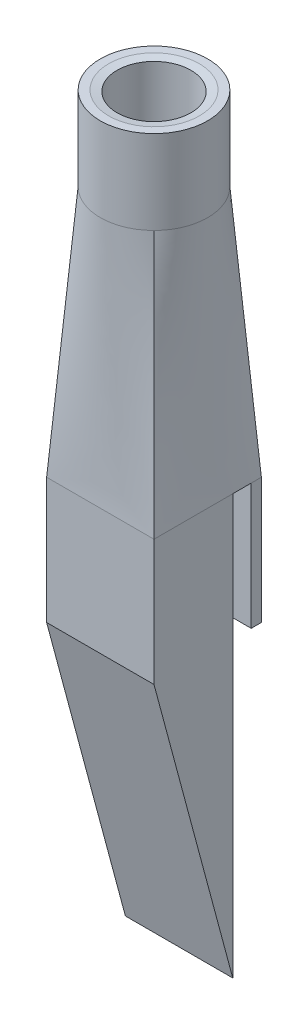
ISO-10303-21;
HEADER;
FILE_DESCRIPTION(('STEP AP214'),'2;1');
FILE_NAME('part.step','',(''),(''),'','','');
FILE_SCHEMA(('AUTOMOTIVE_DESIGN { 1 0 10303 214 1 1 1 1 }'));
ENDSEC;
DATA;
#1=APPLICATION_CONTEXT('core data for automotive mechanical design processes');
#2=APPLICATION_PROTOCOL_DEFINITION('international standard','automotive_design',2000,#1);
#3=PRODUCT_CONTEXT('',#1,'mechanical');
#4=PRODUCT('Part','Part','',(#3));
#5=PRODUCT_RELATED_PRODUCT_CATEGORY('part','',(#4));
#6=PRODUCT_DEFINITION_FORMATION('','',#4);
#7=PRODUCT_DEFINITION_CONTEXT('part definition',#1,'design');
#8=PRODUCT_DEFINITION('design','',#6,#7);
#9=PRODUCT_DEFINITION_SHAPE('','',#8);
#10=(LENGTH_UNIT() NAMED_UNIT(*) SI_UNIT(.MILLI.,.METRE.));
#11=(NAMED_UNIT(*) PLANE_ANGLE_UNIT() SI_UNIT($,.RADIAN.));
#12=(NAMED_UNIT(*) SI_UNIT($,.STERADIAN.) SOLID_ANGLE_UNIT());
#13=UNCERTAINTY_MEASURE_WITH_UNIT(LENGTH_MEASURE(1.E-05),#10,'distance_accuracy_value','');
#14=(GEOMETRIC_REPRESENTATION_CONTEXT(3) GLOBAL_UNCERTAINTY_ASSIGNED_CONTEXT((#13)) GLOBAL_UNIT_ASSIGNED_CONTEXT((#10,
#11,#12)) REPRESENTATION_CONTEXT('',''));
#15=CARTESIAN_POINT('',(0.,0.,0.));
#16=DIRECTION('',(0.,0.,1.));
#17=DIRECTION('',(1.,0.,0.));
#18=AXIS2_PLACEMENT_3D('',#15,#16,#17);
#19=CARTESIAN_POINT('',(0.,-30.,0.));
#20=DIRECTION('',(0.,1.,0.));
#21=DIRECTION('',(0.,0.,1.));
#22=AXIS2_PLACEMENT_3D('',#19,#20,#21);
#23=PLANE('',#22);
#24=DIRECTION('',(-1.,0.,0.));
#25=VECTOR('',#24,1.);
#26=CARTESIAN_POINT('',(0.,-30.,-5.19));
#27=LINE('',#26,#25);
#28=CARTESIAN_POINT('',(6.4,-30.,-5.19));
#29=VERTEX_POINT('',#28);
#30=CARTESIAN_POINT('',(-6.4,-30.,-5.19));
#31=VERTEX_POINT('',#30);
#32=EDGE_CURVE('E97',#29,#31,#27,.T.);
#33=ORIENTED_EDGE('',*,*,#32,.F.);
#34=DIRECTION('',(0.,0.,1.));
#35=VECTOR('',#34,1.);
#36=CARTESIAN_POINT('',(6.4,-30.,-6.4));
#37=LINE('',#36,#35);
#38=CARTESIAN_POINT('',(6.4,-30.,-2.99));
#39=VERTEX_POINT('',#38);
#40=EDGE_CURVE('E415',#29,#39,#37,.T.);
#41=ORIENTED_EDGE('',*,*,#40,.T.);
#42=DIRECTION('',(-1.,0.,0.));
#43=VECTOR('',#42,1.);
#44=CARTESIAN_POINT('',(0.,-30.,-2.99));
#45=LINE('',#44,#43);
#46=CARTESIAN_POINT('',(-6.4,-30.,-2.99));
#47=VERTEX_POINT('',#46);
#48=EDGE_CURVE('E214',#39,#47,#45,.T.);
#49=ORIENTED_EDGE('',*,*,#48,.T.);
#50=DIRECTION('',(0.,0.,-1.));
#51=VECTOR('',#50,1.);
#52=CARTESIAN_POINT('',(-6.4,-30.,-6.4));
#53=LINE('',#52,#51);
#54=EDGE_CURVE('E273',#47,#31,#53,.T.);
#55=ORIENTED_EDGE('',*,*,#54,.T.);
#56=EDGE_LOOP('',(#33,#41,#49,#55));
#57=FACE_BOUND('',#56,.T.);
#58=ADVANCED_FACE('F75',(#57),#23,.F.);
#59=CARTESIAN_POINT('',(0.,10.,0.));
#60=DIRECTION('',(0.,1.,0.));
#61=DIRECTION('',(0.,0.,1.));
#62=AXIS2_PLACEMENT_3D('',#59,#60,#61);
#63=PLANE('',#62);
#64=CARTESIAN_POINT('',(0.,10.,0.));
#65=DIRECTION('',(0.,1.,0.));
#66=DIRECTION('',(0.,0.,1.));
#67=AXIS2_PLACEMENT_3D('',#64,#65,#66);
#68=CIRCLE('',#67,5.40000000000002);
#69=CARTESIAN_POINT('',(0.,10.,5.40000000000002));
#70=VERTEX_POINT('',#69);
#71=EDGE_CURVE('E12',#70,#70,#68,.F.);
#72=ORIENTED_EDGE('',*,*,#71,.T.);
#73=EDGE_LOOP('',(#72));
#74=FACE_BOUND('',#73,.T.);
#75=CARTESIAN_POINT('',(0.,10.,0.));
#76=DIRECTION('',(0.,1.,0.));
#77=DIRECTION('',(0.,0.,1.));
#78=AXIS2_PLACEMENT_3D('',#75,#76,#77);
#79=CIRCLE('',#78,6.4);
#80=CARTESIAN_POINT('',(0.,10.,6.4));
#81=VERTEX_POINT('',#80);
#82=EDGE_CURVE('E647',#81,#81,#79,.T.);
#83=ORIENTED_EDGE('',*,*,#82,.T.);
#84=EDGE_LOOP('',(#83));
#85=FACE_BOUND('',#84,.T.);
#86=ADVANCED_FACE('F298',(#74,#85),#63,.T.);
#87=CARTESIAN_POINT('',(0.,10.,0.));
#88=DIRECTION('',(0.,-1.,0.));
#89=DIRECTION('',(0.,0.,-1.));
#90=AXIS2_PLACEMENT_3D('',#87,#88,#89);
#91=CYLINDRICAL_SURFACE('',#90,6.4);
#92=ORIENTED_EDGE('',*,*,#82,.F.);
#93=EDGE_LOOP('',(#92));
#94=FACE_BOUND('',#93,.T.);
#95=CARTESIAN_POINT('',(4.5254833995939,0.,-4.5254833995939));
#96=CARTESIAN_POINT('',(4.79215006626057,0.,-4.25881673292724));
#97=CARTESIAN_POINT('',(5.04508306967116,0.,-3.95847162228839));
#98=CARTESIAN_POINT('',(5.50172271939158,0.,-3.29445107465197));
#99=CARTESIAN_POINT('',(5.70528151747109,0.,-2.93074172777278));
#100=CARTESIAN_POINT('',(6.0418145209194,0.,-2.15312832021532));
#101=CARTESIAN_POINT('',(6.17462377545561,0.,-1.73928513955465));
#102=CARTESIAN_POINT('',(6.35377211773431,0.,-0.883556133473917));
#103=CARTESIAN_POINT('',(6.4,0.,-0.441827799864635));
#104=CARTESIAN_POINT('',(6.4,0.,0.441827799864634));
#105=CARTESIAN_POINT('',(6.35377211773431,0.,0.883556133473917));
#106=CARTESIAN_POINT('',(6.17462377545561,0.,1.73928513955465));
#107=CARTESIAN_POINT('',(6.0418145209194,0.,2.15312832021532));
#108=CARTESIAN_POINT('',(5.70528151747109,0.,2.93074172777278));
#109=CARTESIAN_POINT('',(5.50172271939158,0.,3.29445107465197));
#110=CARTESIAN_POINT('',(5.04508306967116,0.,3.95847162228839));
#111=CARTESIAN_POINT('',(4.79215006626057,0.,4.25881673292724));
#112=CARTESIAN_POINT('',(4.5254833995939,0.,4.5254833995939));
#113=B_SPLINE_CURVE_WITH_KNOTS('',3,(#95,#96,#97,#98,#99,#100,#101,#102,#103,#104,#105,#106,
#107,#108,#109,#110,#111,#112),.UNSPECIFIED.,.F.,.F.,(4,2,2,2,2,2,2,2,4),(0.,0.125,0.25,0.375,
0.5,0.625,0.75,0.875,1.),.UNSPECIFIED.);
#114=CARTESIAN_POINT('',(4.5254833995939,0.,4.5254833995939));
#115=VERTEX_POINT('',#114);
#116=CARTESIAN_POINT('',(4.5254833995939,0.,-4.5254833995939));
#117=VERTEX_POINT('',#116);
#118=EDGE_CURVE('E650',#115,#117,#113,.F.);
#119=ORIENTED_EDGE('',*,*,#118,.T.);
#120=CARTESIAN_POINT('',(0.,0.,0.));
#121=DIRECTION('',(0.,-1.,0.));
#122=DIRECTION('',(0.,0.,-1.));
#123=AXIS2_PLACEMENT_3D('',#120,#121,#122);
#124=CIRCLE('',#123,6.4);
#125=CARTESIAN_POINT('',(-4.5254833995939,0.,-4.5254833995939));
#126=VERTEX_POINT('',#125);
#127=EDGE_CURVE('E223',#126,#117,#124,.T.);
#128=ORIENTED_EDGE('',*,*,#127,.F.);
#129=CARTESIAN_POINT('',(-4.5254833995939,0.,4.5254833995939));
#130=VERTEX_POINT('',#129);
#131=EDGE_CURVE('E335',#130,#126,#124,.T.);
#132=ORIENTED_EDGE('',*,*,#131,.F.);
#133=EDGE_CURVE('E338',#115,#130,#124,.T.);
#134=ORIENTED_EDGE('',*,*,#133,.F.);
#135=EDGE_LOOP('',(#119,#128,#132,#134));
#136=FACE_BOUND('',#135,.T.);
#137=ADVANCED_FACE('F308',(#94,#136),#91,.T.);
#138=CARTESIAN_POINT('',(0.,10.,0.));
#139=DIRECTION('',(0.,-1.,0.));
#140=DIRECTION('',(0.,0.,-1.));
#141=AXIS2_PLACEMENT_3D('',#138,#139,#140);
#142=CYLINDRICAL_SURFACE('',#141,4.4);
#143=CARTESIAN_POINT('',(0.,9.82367301929154,0.));
#144=DIRECTION('',(0.,1.,0.));
#145=DIRECTION('',(0.,0.,1.));
#146=AXIS2_PLACEMENT_3D('',#143,#144,#145);
#147=CIRCLE('',#146,4.4);
#148=CARTESIAN_POINT('',(0.,9.82367301929154,4.4));
#149=VERTEX_POINT('',#148);
#150=EDGE_CURVE('E86',#149,#149,#147,.T.);
#151=ORIENTED_EDGE('',*,*,#150,.T.);
#152=EDGE_LOOP('',(#151));
#153=FACE_BOUND('',#152,.T.);
#154=CARTESIAN_POINT('',(0.,0.,0.));
#155=DIRECTION('',(0.,1.,0.));
#156=DIRECTION('',(0.,0.,1.));
#157=AXIS2_PLACEMENT_3D('',#154,#155,#156);
#158=CIRCLE('',#157,4.4);
#159=CARTESIAN_POINT('',(0.,0.,4.4));
#160=VERTEX_POINT('',#159);
#161=EDGE_CURVE('E286',#160,#160,#158,.T.);
#162=ORIENTED_EDGE('',*,*,#161,.F.);
#163=EDGE_LOOP('',(#162));
#164=FACE_BOUND('',#163,.T.);
#165=ADVANCED_FACE('F304',(#153,#164),#142,.F.);
#166=CARTESIAN_POINT('',(0.,9.82367301929154,0.));
#167=DIRECTION('',(0.,1.,0.));
#168=DIRECTION('',(0.,0.,1.));
#169=AXIS2_PLACEMENT_3D('',#166,#167,#168);
#170=CONICAL_SURFACE('',#169,4.4,1.39626340159547);
#171=ORIENTED_EDGE('',*,*,#71,.F.);
#172=EDGE_LOOP('',(#171));
#173=FACE_BOUND('',#172,.T.);
#174=ORIENTED_EDGE('',*,*,#150,.F.);
#175=EDGE_LOOP('',(#174));
#176=FACE_BOUND('',#175,.T.);
#177=ADVANCED_FACE('F78',(#173,#176),#170,.F.);
#178=CARTESIAN_POINT('',(0.,0.,0.));
#179=DIRECTION('',(0.,-1.,0.));
#180=DIRECTION('',(0.,0.,-1.));
#181=AXIS2_PLACEMENT_3D('',#178,#179,#180);
#182=PLANE('',#181);
#183=ORIENTED_EDGE('',*,*,#161,.T.);
#184=EDGE_LOOP('',(#183));
#185=FACE_BOUND('',#184,.T.);
#186=ADVANCED_FACE('F587',(#185),#182,.F.);
#187=CARTESIAN_POINT('',(-4.5254833995939,0.,-4.5254833995939));
#188=CARTESIAN_POINT('',(-6.4,-30.,-6.4));
#189=CARTESIAN_POINT('',(-4.25881673292724,0.,-4.79215006626057));
#190=CARTESIAN_POINT('',(-5.86666666666667,-30.,-6.4));
#191=CARTESIAN_POINT('',(-3.95847162228839,0.,-5.04508306967116));
#192=CARTESIAN_POINT('',(-5.33333333333333,-30.,-6.4));
#193=CARTESIAN_POINT('',(-3.29445107465197,0.,-5.50172271939158));
#194=CARTESIAN_POINT('',(-4.26666666666666,-30.,-6.4));
#195=CARTESIAN_POINT('',(-2.93074172777278,0.,-5.70528151747108));
#196=CARTESIAN_POINT('',(-3.73333333333333,-30.,-6.4));
#197=CARTESIAN_POINT('',(-2.15312832021532,0.,-6.0418145209194));
#198=CARTESIAN_POINT('',(-2.66666666666667,-30.,-6.4));
#199=CARTESIAN_POINT('',(-1.73928513955465,0.,-6.17462377545561));
#200=CARTESIAN_POINT('',(-2.13333333333333,-30.,-6.4));
#201=CARTESIAN_POINT('',(-0.883556133473918,0.,-6.3537721177343));
#202=CARTESIAN_POINT('',(-1.06666666666667,-30.,-6.4));
#203=CARTESIAN_POINT('',(-0.441827799864636,0.,-6.4));
#204=CARTESIAN_POINT('',(-0.533333333333333,-30.,-6.4));
#205=CARTESIAN_POINT('',(0.441827799864634,0.,-6.4));
#206=CARTESIAN_POINT('',(0.533333333333334,-30.,-6.4));
#207=CARTESIAN_POINT('',(0.883556133473917,0.,-6.35377211773431));
#208=CARTESIAN_POINT('',(1.06666666666667,-30.,-6.4));
#209=CARTESIAN_POINT('',(1.73928513955465,0.,-6.17462377545561));
#210=CARTESIAN_POINT('',(2.13333333333333,-30.,-6.4));
#211=CARTESIAN_POINT('',(2.15312832021532,0.,-6.0418145209194));
#212=CARTESIAN_POINT('',(2.66666666666667,-30.,-6.4));
#213=CARTESIAN_POINT('',(2.93074172777278,0.,-5.70528151747108));
#214=CARTESIAN_POINT('',(3.73333333333333,-30.,-6.4));
#215=CARTESIAN_POINT('',(3.29445107465197,0.,-5.50172271939158));
#216=CARTESIAN_POINT('',(4.26666666666667,-30.,-6.4));
#217=CARTESIAN_POINT('',(3.95847162228839,0.,-5.04508306967116));
#218=CARTESIAN_POINT('',(5.33333333333333,-30.,-6.4));
#219=CARTESIAN_POINT('',(4.25881673292724,0.,-4.79215006626057));
#220=CARTESIAN_POINT('',(5.86666666666667,-30.,-6.4));
#221=CARTESIAN_POINT('',(4.5254833995939,0.,-4.5254833995939));
#222=CARTESIAN_POINT('',(6.4,-30.,-6.4));
#223=B_SPLINE_SURFACE_WITH_KNOTS('',3,1,((#187,#188),(#189,#190),(#191,#192),(#193,#194),(#195,
#196),(#197,#198),(#199,#200),(#201,#202),(#203,#204),(#205,#206),(#207,#208),(#209,#210),(#211,
#212),(#213,#214),(#215,#216),(#217,#218),(#219,#220),(#221,#222)),.UNSPECIFIED.,.F.,.F.,.F.,(4,
2,2,2,2,2,2,2,4),(2,2),(0.,0.125,0.25,0.375,0.5,0.625,0.75,0.875,1.),(0.,1.),.UNSPECIFIED.);
#224=DIRECTION('',(0.0622413542695361,-0.996118480722744,-0.0622413542695361));
#225=VECTOR('',#224,1.);
#226=CARTESIAN_POINT('',(5.46274169979695,-15.,-5.46274169979695));
#227=LINE('',#226,#225);
#228=CARTESIAN_POINT('',(6.4,-30.,-6.4));
#229=VERTEX_POINT('',#228);
#230=EDGE_CURVE('E661',#117,#229,#227,.T.);
#231=DIRECTION('',(1.,0.,0.));
#232=VECTOR('',#231,1.);
#233=CARTESIAN_POINT('',(-6.4,-30.,-6.4));
#234=LINE('',#233,#232);
#235=CARTESIAN_POINT('',(-6.4,-30.,-6.4));
#236=VERTEX_POINT('',#235);
#237=EDGE_CURVE('E80',#236,#229,#234,.T.);
#238=DIRECTION('',(0.0622413542695361,0.996118480722744,0.0622413542695361));
#239=VECTOR('',#238,1.);
#240=CARTESIAN_POINT('',(-5.46274169979695,-15.,-5.46274169979695));
#241=LINE('',#240,#239);
#242=EDGE_CURVE('E340',#236,#126,#241,.T.);
#243=ORIENTED_EDGE('',*,*,#127,.T.);
#244=ORIENTED_EDGE('',*,*,#230,.T.);
#245=ORIENTED_EDGE('',*,*,#237,.F.);
#246=ORIENTED_EDGE('',*,*,#242,.T.);
#247=EDGE_LOOP('',(#243,#244,#245,#246));
#248=FACE_BOUND('',#247,.T.);
#249=ADVANCED_FACE('F368',(#248),#223,.T.);
#250=CARTESIAN_POINT('',(4.5254833995939,0.,-4.5254833995939));
#251=CARTESIAN_POINT('',(6.4,-30.,-6.4));
#252=CARTESIAN_POINT('',(4.79215006626057,0.,-4.25881673292724));
#253=CARTESIAN_POINT('',(6.4,-30.,-5.86666666666667));
#254=CARTESIAN_POINT('',(5.04508306967116,0.,-3.95847162228839));
#255=CARTESIAN_POINT('',(6.4,-30.,-5.33333333333333));
#256=CARTESIAN_POINT('',(5.50172271939158,0.,-3.29445107465197));
#257=CARTESIAN_POINT('',(6.4,-30.,-4.26666666666667));
#258=CARTESIAN_POINT('',(5.70528151747109,0.,-2.93074172777278));
#259=CARTESIAN_POINT('',(6.4,-30.,-3.73333333333333));
#260=CARTESIAN_POINT('',(6.0418145209194,0.,-2.15312832021532));
#261=CARTESIAN_POINT('',(6.4,-30.,-2.66666666666667));
#262=CARTESIAN_POINT('',(6.17462377545561,0.,-1.73928513955465));
#263=CARTESIAN_POINT('',(6.4,-30.,-2.13333333333333));
#264=CARTESIAN_POINT('',(6.35377211773431,0.,-0.883556133473917));
#265=CARTESIAN_POINT('',(6.4,-30.,-1.06666666666667));
#266=CARTESIAN_POINT('',(6.4,0.,-0.441827799864635));
#267=CARTESIAN_POINT('',(6.4,-30.,-0.533333333333334));
#268=CARTESIAN_POINT('',(6.4,0.,0.441827799864634));
#269=CARTESIAN_POINT('',(6.4,-30.,0.533333333333333));
#270=CARTESIAN_POINT('',(6.35377211773431,0.,0.883556133473917));
#271=CARTESIAN_POINT('',(6.4,-30.,1.06666666666667));
#272=CARTESIAN_POINT('',(6.17462377545561,0.,1.73928513955465));
#273=CARTESIAN_POINT('',(6.4,-30.,2.13333333333333));
#274=CARTESIAN_POINT('',(6.0418145209194,0.,2.15312832021532));
#275=CARTESIAN_POINT('',(6.4,-30.,2.66666666666667));
#276=CARTESIAN_POINT('',(5.70528151747109,0.,2.93074172777278));
#277=CARTESIAN_POINT('',(6.4,-30.,3.73333333333333));
#278=CARTESIAN_POINT('',(5.50172271939158,0.,3.29445107465197));
#279=CARTESIAN_POINT('',(6.4,-30.,4.26666666666667));
#280=CARTESIAN_POINT('',(5.04508306967116,0.,3.95847162228839));
#281=CARTESIAN_POINT('',(6.4,-30.,5.33333333333333));
#282=CARTESIAN_POINT('',(4.79215006626057,0.,4.25881673292724));
#283=CARTESIAN_POINT('',(6.4,-30.,5.86666666666667));
#284=CARTESIAN_POINT('',(4.5254833995939,0.,4.5254833995939));
#285=CARTESIAN_POINT('',(6.4,-30.,6.4));
#286=B_SPLINE_SURFACE_WITH_KNOTS('',3,1,((#250,#251),(#252,#253),(#254,#255),(#256,#257),(#258,
#259),(#260,#261),(#262,#263),(#264,#265),(#266,#267),(#268,#269),(#270,#271),(#272,#273),(#274,
#275),(#276,#277),(#278,#279),(#280,#281),(#282,#283),(#284,#285)),.UNSPECIFIED.,.F.,.F.,.F.,(4,
2,2,2,2,2,2,2,4),(2,2),(0.,0.125,0.25,0.375,0.5,0.625,0.75,0.875,1.),(0.,1.),.UNSPECIFIED.);
#287=DIRECTION('',(0.0622413542695361,-0.996118480722744,0.0622413542695361));
#288=VECTOR('',#287,1.);
#289=CARTESIAN_POINT('',(5.46274169979695,-15.,5.46274169979695));
#290=LINE('',#289,#288);
#291=CARTESIAN_POINT('',(6.4,-30.,6.4));
#292=VERTEX_POINT('',#291);
#293=EDGE_CURVE('E664',#115,#292,#290,.T.);
#294=CARTESIAN_POINT('',(6.4,-30.,6.4));
#295=CARTESIAN_POINT('',(6.4,-30.,5.86666666666667));
#296=CARTESIAN_POINT('',(6.4,-30.,5.33333333333333));
#297=CARTESIAN_POINT('',(6.4,-30.,4.26666666666667));
#298=CARTESIAN_POINT('',(6.4,-30.,3.73333333333333));
#299=CARTESIAN_POINT('',(6.4,-30.,2.66666666666667));
#300=CARTESIAN_POINT('',(6.4,-30.,2.13333333333333));
#301=CARTESIAN_POINT('',(6.4,-30.,1.06666666666667));
#302=CARTESIAN_POINT('',(6.4,-30.,0.533333333333333));
#303=CARTESIAN_POINT('',(6.4,-30.,-0.533333333333334));
#304=CARTESIAN_POINT('',(6.4,-30.,-1.06666666666667));
#305=CARTESIAN_POINT('',(6.4,-30.,-2.13333333333333));
#306=CARTESIAN_POINT('',(6.4,-30.,-2.66666666666667));
#307=CARTESIAN_POINT('',(6.4,-30.,-3.73333333333333));
#308=CARTESIAN_POINT('',(6.4,-30.,-4.26666666666667));
#309=CARTESIAN_POINT('',(6.4,-30.,-5.33333333333333));
#310=CARTESIAN_POINT('',(6.4,-30.,-5.86666666666667));
#311=CARTESIAN_POINT('',(6.4,-30.,-6.4));
#312=B_SPLINE_CURVE_WITH_KNOTS('',3,(#294,#295,#296,#297,#298,#299,#300,#301,#302,#303,#304,
#305,#306,#307,#308,#309,#310,#311),.UNSPECIFIED.,.F.,.F.,(4,2,2,2,2,2,2,2,4),(0.,0.125,0.25,
0.375,0.5,0.625,0.75,0.875,1.),.UNSPECIFIED.);
#313=EDGE_CURVE('E208',#292,#39,#312,.T.);
#314=EDGE_CURVE('E274',#229,#29,#37,.T.);
#315=ORIENTED_EDGE('',*,*,#118,.F.);
#316=ORIENTED_EDGE('',*,*,#293,.T.);
#317=ORIENTED_EDGE('',*,*,#313,.T.);
#318=ORIENTED_EDGE('',*,*,#40,.F.);
#319=ORIENTED_EDGE('',*,*,#314,.F.);
#320=ORIENTED_EDGE('',*,*,#230,.F.);
#321=EDGE_LOOP('',(#315,#316,#317,#318,#319,#320));
#322=FACE_BOUND('',#321,.T.);
#323=ADVANCED_FACE('F356',(#322),#286,.T.);
#324=CARTESIAN_POINT('',(-4.5254833995939,0.,4.5254833995939));
#325=CARTESIAN_POINT('',(-6.4,-30.,6.4));
#326=CARTESIAN_POINT('',(-4.79215006626057,0.,4.25881673292724));
#327=CARTESIAN_POINT('',(-6.4,-30.,5.86666666666667));
#328=CARTESIAN_POINT('',(-5.04508306967116,0.,3.95847162228839));
#329=CARTESIAN_POINT('',(-6.4,-30.,5.33333333333333));
#330=CARTESIAN_POINT('',(-5.50172271939158,0.,3.29445107465197));
#331=CARTESIAN_POINT('',(-6.4,-30.,4.26666666666667));
#332=CARTESIAN_POINT('',(-5.70528151747109,0.,2.93074172777278));
#333=CARTESIAN_POINT('',(-6.4,-30.,3.73333333333333));
#334=CARTESIAN_POINT('',(-6.0418145209194,0.,2.15312832021532));
#335=CARTESIAN_POINT('',(-6.4,-30.,2.66666666666667));
#336=CARTESIAN_POINT('',(-6.17462377545561,0.,1.73928513955465));
#337=CARTESIAN_POINT('',(-6.4,-30.,2.13333333333333));
#338=CARTESIAN_POINT('',(-6.35377211773431,0.,0.883556133473918));
#339=CARTESIAN_POINT('',(-6.4,-30.,1.06666666666667));
#340=CARTESIAN_POINT('',(-6.4,0.,0.441827799864636));
#341=CARTESIAN_POINT('',(-6.4,-30.,0.533333333333334));
#342=CARTESIAN_POINT('',(-6.4,0.,-0.441827799864634));
#343=CARTESIAN_POINT('',(-6.4,-30.,-0.533333333333333));
#344=CARTESIAN_POINT('',(-6.35377211773431,0.,-0.883556133473916));
#345=CARTESIAN_POINT('',(-6.4,-30.,-1.06666666666667));
#346=CARTESIAN_POINT('',(-6.17462377545561,0.,-1.73928513955465));
#347=CARTESIAN_POINT('',(-6.4,-30.,-2.13333333333333));
#348=CARTESIAN_POINT('',(-6.0418145209194,0.,-2.15312832021532));
#349=CARTESIAN_POINT('',(-6.4,-30.,-2.66666666666667));
#350=CARTESIAN_POINT('',(-5.70528151747109,0.,-2.93074172777278));
#351=CARTESIAN_POINT('',(-6.4,-30.,-3.73333333333333));
#352=CARTESIAN_POINT('',(-5.50172271939158,0.,-3.29445107465197));
#353=CARTESIAN_POINT('',(-6.4,-30.,-4.26666666666667));
#354=CARTESIAN_POINT('',(-5.04508306967116,0.,-3.95847162228839));
#355=CARTESIAN_POINT('',(-6.4,-30.,-5.33333333333333));
#356=CARTESIAN_POINT('',(-4.79215006626057,0.,-4.25881673292724));
#357=CARTESIAN_POINT('',(-6.4,-30.,-5.86666666666667));
#358=CARTESIAN_POINT('',(-4.5254833995939,0.,-4.5254833995939));
#359=CARTESIAN_POINT('',(-6.4,-30.,-6.4));
#360=B_SPLINE_SURFACE_WITH_KNOTS('',3,1,((#324,#325),(#326,#327),(#328,#329),(#330,#331),(#332,
#333),(#334,#335),(#336,#337),(#338,#339),(#340,#341),(#342,#343),(#344,#345),(#346,#347),(#348,
#349),(#350,#351),(#352,#353),(#354,#355),(#356,#357),(#358,#359)),.UNSPECIFIED.,.F.,.F.,.F.,(4,
2,2,2,2,2,2,2,4),(2,2),(0.,0.125,0.25,0.375,0.5,0.625,0.75,0.875,1.),(0.,1.),.UNSPECIFIED.);
#361=CARTESIAN_POINT('',(-6.4,-30.,-6.4));
#362=CARTESIAN_POINT('',(-6.4,-30.,-5.86666666666667));
#363=CARTESIAN_POINT('',(-6.4,-30.,-5.33333333333333));
#364=CARTESIAN_POINT('',(-6.4,-30.,-4.26666666666667));
#365=CARTESIAN_POINT('',(-6.4,-30.,-3.73333333333333));
#366=CARTESIAN_POINT('',(-6.4,-30.,-2.66666666666667));
#367=CARTESIAN_POINT('',(-6.4,-30.,-2.13333333333333));
#368=CARTESIAN_POINT('',(-6.4,-30.,-1.06666666666667));
#369=CARTESIAN_POINT('',(-6.4,-30.,-0.533333333333333));
#370=CARTESIAN_POINT('',(-6.4,-30.,0.533333333333334));
#371=CARTESIAN_POINT('',(-6.4,-30.,1.06666666666667));
#372=CARTESIAN_POINT('',(-6.4,-30.,2.13333333333333));
#373=CARTESIAN_POINT('',(-6.4,-30.,2.66666666666667));
#374=CARTESIAN_POINT('',(-6.4,-30.,3.73333333333333));
#375=CARTESIAN_POINT('',(-6.4,-30.,4.26666666666667));
#376=CARTESIAN_POINT('',(-6.4,-30.,5.33333333333333));
#377=CARTESIAN_POINT('',(-6.4,-30.,5.86666666666667));
#378=CARTESIAN_POINT('',(-6.4,-30.,6.4));
#379=B_SPLINE_CURVE_WITH_KNOTS('',3,(#361,#362,#363,#364,#365,#366,#367,#368,#369,#370,#371,
#372,#373,#374,#375,#376,#377,#378),.UNSPECIFIED.,.F.,.F.,(4,2,2,2,2,2,2,2,4),(0.,0.125,0.25,
0.375,0.5,0.625,0.75,0.875,1.),.UNSPECIFIED.);
#380=EDGE_CURVE('E105',#236,#31,#379,.T.);
#381=CARTESIAN_POINT('',(-6.4,-30.,6.4));
#382=VERTEX_POINT('',#381);
#383=EDGE_CURVE('E169',#382,#47,#53,.T.);
#384=DIRECTION('',(-0.0622413542695361,-0.996118480722744,0.0622413542695361));
#385=VECTOR('',#384,1.);
#386=CARTESIAN_POINT('',(-5.46274169979695,-15.,5.46274169979695));
#387=LINE('',#386,#385);
#388=EDGE_CURVE('E418',#130,#382,#387,.T.);
#389=ORIENTED_EDGE('',*,*,#131,.T.);
#390=ORIENTED_EDGE('',*,*,#242,.F.);
#391=ORIENTED_EDGE('',*,*,#380,.T.);
#392=ORIENTED_EDGE('',*,*,#54,.F.);
#393=ORIENTED_EDGE('',*,*,#383,.F.);
#394=ORIENTED_EDGE('',*,*,#388,.F.);
#395=EDGE_LOOP('',(#389,#390,#391,#392,#393,#394));
#396=FACE_BOUND('',#395,.T.);
#397=ADVANCED_FACE('F367',(#396),#360,.T.);
#398=CARTESIAN_POINT('',(4.5254833995939,0.,4.5254833995939));
#399=CARTESIAN_POINT('',(6.4,-30.,6.4));
#400=CARTESIAN_POINT('',(4.25881673292724,0.,4.79215006626057));
#401=CARTESIAN_POINT('',(5.86666666666667,-30.,6.4));
#402=CARTESIAN_POINT('',(3.95847162228839,0.,5.04508306967116));
#403=CARTESIAN_POINT('',(5.33333333333333,-30.,6.4));
#404=CARTESIAN_POINT('',(3.29445107465197,0.,5.50172271939158));
#405=CARTESIAN_POINT('',(4.26666666666667,-30.,6.4));
#406=CARTESIAN_POINT('',(2.93074172777278,0.,5.70528151747109));
#407=CARTESIAN_POINT('',(3.73333333333333,-30.,6.4));
#408=CARTESIAN_POINT('',(2.15312832021532,0.,6.0418145209194));
#409=CARTESIAN_POINT('',(2.66666666666667,-30.,6.4));
#410=CARTESIAN_POINT('',(1.73928513955465,0.,6.17462377545561));
#411=CARTESIAN_POINT('',(2.13333333333333,-30.,6.4));
#412=CARTESIAN_POINT('',(0.883556133473917,0.,6.35377211773431));
#413=CARTESIAN_POINT('',(1.06666666666667,-30.,6.4));
#414=CARTESIAN_POINT('',(0.441827799864635,0.,6.4));
#415=CARTESIAN_POINT('',(0.533333333333334,-30.,6.4));
#416=CARTESIAN_POINT('',(-0.441827799864634,0.,6.4));
#417=CARTESIAN_POINT('',(-0.533333333333333,-30.,6.4));
#418=CARTESIAN_POINT('',(-0.883556133473917,0.,6.35377211773431));
#419=CARTESIAN_POINT('',(-1.06666666666667,-30.,6.4));
#420=CARTESIAN_POINT('',(-1.73928513955465,0.,6.17462377545561));
#421=CARTESIAN_POINT('',(-2.13333333333333,-30.,6.4));
#422=CARTESIAN_POINT('',(-2.15312832021532,0.,6.0418145209194));
#423=CARTESIAN_POINT('',(-2.66666666666667,-30.,6.4));
#424=CARTESIAN_POINT('',(-2.93074172777278,0.,5.70528151747109));
#425=CARTESIAN_POINT('',(-3.73333333333333,-30.,6.4));
#426=CARTESIAN_POINT('',(-3.29445107465197,0.,5.50172271939158));
#427=CARTESIAN_POINT('',(-4.26666666666667,-30.,6.4));
#428=CARTESIAN_POINT('',(-3.95847162228839,0.,5.04508306967116));
#429=CARTESIAN_POINT('',(-5.33333333333333,-30.,6.4));
#430=CARTESIAN_POINT('',(-4.25881673292724,0.,4.79215006626057));
#431=CARTESIAN_POINT('',(-5.86666666666667,-30.,6.4));
#432=CARTESIAN_POINT('',(-4.5254833995939,0.,4.5254833995939));
#433=CARTESIAN_POINT('',(-6.4,-30.,6.4));
#434=B_SPLINE_SURFACE_WITH_KNOTS('',3,1,((#398,#399),(#400,#401),(#402,#403),(#404,#405),(#406,
#407),(#408,#409),(#410,#411),(#412,#413),(#414,#415),(#416,#417),(#418,#419),(#420,#421),(#422,
#423),(#424,#425),(#426,#427),(#428,#429),(#430,#431),(#432,#433)),.UNSPECIFIED.,.F.,.F.,.F.,(4,
2,2,2,2,2,2,2,4),(2,2),(0.,0.125,0.25,0.375,0.5,0.625,0.75,0.875,1.),(0.,1.),.UNSPECIFIED.);
#435=DIRECTION('',(-1.,0.,0.));
#436=VECTOR('',#435,1.);
#437=CARTESIAN_POINT('',(-6.4,-30.,6.4));
#438=LINE('',#437,#436);
#439=EDGE_CURVE('E271',#292,#382,#438,.T.);
#440=ORIENTED_EDGE('',*,*,#133,.T.);
#441=ORIENTED_EDGE('',*,*,#388,.T.);
#442=ORIENTED_EDGE('',*,*,#439,.F.);
#443=ORIENTED_EDGE('',*,*,#293,.F.);
#444=EDGE_LOOP('',(#440,#441,#442,#443));
#445=FACE_BOUND('',#444,.T.);
#446=ADVANCED_FACE('F299',(#445),#434,.T.);
#447=CARTESIAN_POINT('',(0.,-45.,-2.99));
#448=DIRECTION('',(0.,0.,-1.));
#449=DIRECTION('',(-1.,0.,0.));
#450=AXIS2_PLACEMENT_3D('',#447,#448,#449);
#451=PLANE('',#450);
#452=ORIENTED_EDGE('',*,*,#48,.F.);
#453=DIRECTION('',(0.,1.,0.));
#454=VECTOR('',#453,1.);
#455=CARTESIAN_POINT('',(6.4,-45.,-2.99));
#456=LINE('',#455,#454);
#457=CARTESIAN_POINT('',(6.4,-80.,-2.99000000000001));
#458=VERTEX_POINT('',#457);
#459=EDGE_CURVE('E182',#458,#39,#456,.T.);
#460=ORIENTED_EDGE('',*,*,#459,.F.);
#461=DIRECTION('',(-1.,0.,0.));
#462=VECTOR('',#461,1.);
#463=CARTESIAN_POINT('',(42.6377165395393,-80.,-2.99000000000001));
#464=LINE('',#463,#462);
#465=CARTESIAN_POINT('',(-6.4,-80.,-2.99000000000001));
#466=VERTEX_POINT('',#465);
#467=EDGE_CURVE('E179',#458,#466,#464,.T.);
#468=ORIENTED_EDGE('',*,*,#467,.T.);
#469=DIRECTION('',(0.,1.,0.));
#470=VECTOR('',#469,1.);
#471=CARTESIAN_POINT('',(-6.4,-45.,-2.99));
#472=LINE('',#471,#470);
#473=EDGE_CURVE('E162',#466,#47,#472,.T.);
#474=ORIENTED_EDGE('',*,*,#473,.T.);
#475=EDGE_LOOP('',(#452,#460,#468,#474));
#476=FACE_BOUND('',#475,.T.);
#477=ADVANCED_FACE('F180',(#476),#451,.T.);
#478=CARTESIAN_POINT('',(6.4,-45.,0.));
#479=DIRECTION('',(1.,0.,0.));
#480=DIRECTION('',(0.,0.,-1.));
#481=AXIS2_PLACEMENT_3D('',#478,#479,#480);
#482=PLANE('',#481);
#483=ORIENTED_EDGE('',*,*,#313,.F.);
#484=DIRECTION('',(0.,1.,0.));
#485=VECTOR('',#484,1.);
#486=CARTESIAN_POINT('',(6.4,-45.,6.4));
#487=LINE('',#486,#485);
#488=CARTESIAN_POINT('',(6.4,-45.,6.4));
#489=VERTEX_POINT('',#488);
#490=EDGE_CURVE('E224',#489,#292,#487,.T.);
#491=ORIENTED_EDGE('',*,*,#490,.F.);
#492=DIRECTION('',(0.,-0.965844521737764,-0.25912228740336));
#493=VECTOR('',#492,1.);
#494=CARTESIAN_POINT('',(6.4,-80.,-2.99000000000001));
#495=LINE('',#494,#493);
#496=EDGE_CURVE('E185',#489,#458,#495,.T.);
#497=ORIENTED_EDGE('',*,*,#496,.T.);
#498=ORIENTED_EDGE('',*,*,#459,.T.);
#499=EDGE_LOOP('',(#483,#491,#497,#498));
#500=FACE_BOUND('',#499,.T.);
#501=ADVANCED_FACE('F238',(#500),#482,.T.);
#502=CARTESIAN_POINT('',(0.,-45.,6.4));
#503=DIRECTION('',(0.,0.,1.));
#504=DIRECTION('',(1.,0.,0.));
#505=AXIS2_PLACEMENT_3D('',#502,#503,#504);
#506=PLANE('',#505);
#507=ORIENTED_EDGE('',*,*,#439,.T.);
#508=DIRECTION('',(0.,1.,0.));
#509=VECTOR('',#508,1.);
#510=CARTESIAN_POINT('',(-6.4,-45.,6.4));
#511=LINE('',#510,#509);
#512=CARTESIAN_POINT('',(-6.4,-45.,6.4));
#513=VERTEX_POINT('',#512);
#514=EDGE_CURVE('E175',#513,#382,#511,.T.);
#515=ORIENTED_EDGE('',*,*,#514,.F.);
#516=DIRECTION('',(1.,0.,0.));
#517=VECTOR('',#516,1.);
#518=CARTESIAN_POINT('',(0.,-45.,6.4));
#519=LINE('',#518,#517);
#520=EDGE_CURVE('E176',#513,#489,#519,.T.);
#521=ORIENTED_EDGE('',*,*,#520,.T.);
#522=ORIENTED_EDGE('',*,*,#490,.T.);
#523=EDGE_LOOP('',(#507,#515,#521,#522));
#524=FACE_BOUND('',#523,.T.);
#525=ADVANCED_FACE('F248',(#524),#506,.T.);
#526=CARTESIAN_POINT('',(-6.4,-45.,0.));
#527=DIRECTION('',(-1.,0.,0.));
#528=DIRECTION('',(0.,0.,1.));
#529=AXIS2_PLACEMENT_3D('',#526,#527,#528);
#530=PLANE('',#529);
#531=ORIENTED_EDGE('',*,*,#383,.T.);
#532=ORIENTED_EDGE('',*,*,#473,.F.);
#533=DIRECTION('',(0.,-0.965844521737764,-0.25912228740336));
#534=VECTOR('',#533,1.);
#535=CARTESIAN_POINT('',(-6.4,-80.,-2.99000000000001));
#536=LINE('',#535,#534);
#537=EDGE_CURVE('E166',#513,#466,#536,.T.);
#538=ORIENTED_EDGE('',*,*,#537,.F.);
#539=ORIENTED_EDGE('',*,*,#514,.T.);
#540=EDGE_LOOP('',(#531,#532,#538,#539));
#541=FACE_BOUND('',#540,.T.);
#542=ADVANCED_FACE('F164',(#541),#530,.T.);
#543=CARTESIAN_POINT('',(0.,-45.,-5.19));
#544=DIRECTION('',(0.,0.,-1.));
#545=DIRECTION('',(-1.,0.,0.));
#546=AXIS2_PLACEMENT_3D('',#543,#544,#545);
#547=PLANE('',#546);
#548=ORIENTED_EDGE('',*,*,#32,.T.);
#549=DIRECTION('',(0.,1.,0.));
#550=VECTOR('',#549,1.);
#551=CARTESIAN_POINT('',(-6.4,-45.,-5.19));
#552=LINE('',#551,#550);
#553=CARTESIAN_POINT('',(-6.4,-45.,-5.19));
#554=VERTEX_POINT('',#553);
#555=EDGE_CURVE('E216',#554,#31,#552,.T.);
#556=ORIENTED_EDGE('',*,*,#555,.F.);
#557=DIRECTION('',(-1.,0.,0.));
#558=VECTOR('',#557,1.);
#559=CARTESIAN_POINT('',(0.,-45.,-5.19));
#560=LINE('',#559,#558);
#561=CARTESIAN_POINT('',(6.4,-45.,-5.19));
#562=VERTEX_POINT('',#561);
#563=EDGE_CURVE('E193',#562,#554,#560,.T.);
#564=ORIENTED_EDGE('',*,*,#563,.F.);
#565=DIRECTION('',(0.,1.,0.));
#566=VECTOR('',#565,1.);
#567=CARTESIAN_POINT('',(6.4,-45.,-5.19));
#568=LINE('',#567,#566);
#569=EDGE_CURVE('E206',#562,#29,#568,.T.);
#570=ORIENTED_EDGE('',*,*,#569,.T.);
#571=EDGE_LOOP('',(#548,#556,#564,#570));
#572=FACE_BOUND('',#571,.T.);
#573=ADVANCED_FACE('F249',(#572),#547,.F.);
#574=CARTESIAN_POINT('',(-6.4,-45.,0.));
#575=DIRECTION('',(-1.,0.,0.));
#576=DIRECTION('',(0.,0.,1.));
#577=AXIS2_PLACEMENT_3D('',#574,#575,#576);
#578=PLANE('',#577);
#579=ORIENTED_EDGE('',*,*,#380,.F.);
#580=DIRECTION('',(0.,1.,0.));
#581=VECTOR('',#580,1.);
#582=CARTESIAN_POINT('',(-6.4,-45.,-6.4));
#583=LINE('',#582,#581);
#584=CARTESIAN_POINT('',(-6.4,-45.,-6.4));
#585=VERTEX_POINT('',#584);
#586=EDGE_CURVE('E408',#585,#236,#583,.T.);
#587=ORIENTED_EDGE('',*,*,#586,.F.);
#588=DIRECTION('',(0.,0.,1.));
#589=VECTOR('',#588,1.);
#590=CARTESIAN_POINT('',(-6.4,-45.,0.));
#591=LINE('',#590,#589);
#592=EDGE_CURVE('E195',#585,#554,#591,.T.);
#593=ORIENTED_EDGE('',*,*,#592,.T.);
#594=ORIENTED_EDGE('',*,*,#555,.T.);
#595=EDGE_LOOP('',(#579,#587,#593,#594));
#596=FACE_BOUND('',#595,.T.);
#597=ADVANCED_FACE('F449',(#596),#578,.T.);
#598=CARTESIAN_POINT('',(0.,-45.,-6.4));
#599=DIRECTION('',(0.,0.,-1.));
#600=DIRECTION('',(-1.,0.,0.));
#601=AXIS2_PLACEMENT_3D('',#598,#599,#600);
#602=PLANE('',#601);
#603=ORIENTED_EDGE('',*,*,#237,.T.);
#604=DIRECTION('',(0.,1.,0.));
#605=VECTOR('',#604,1.);
#606=CARTESIAN_POINT('',(6.4,-45.,-6.4));
#607=LINE('',#606,#605);
#608=CARTESIAN_POINT('',(6.4,-45.,-6.4));
#609=VERTEX_POINT('',#608);
#610=EDGE_CURVE('E422',#609,#229,#607,.T.);
#611=ORIENTED_EDGE('',*,*,#610,.F.);
#612=DIRECTION('',(-1.,0.,0.));
#613=VECTOR('',#612,1.);
#614=CARTESIAN_POINT('',(0.,-45.,-6.4));
#615=LINE('',#614,#613);
#616=EDGE_CURVE('E199',#609,#585,#615,.T.);
#617=ORIENTED_EDGE('',*,*,#616,.T.);
#618=ORIENTED_EDGE('',*,*,#586,.T.);
#619=EDGE_LOOP('',(#603,#611,#617,#618));
#620=FACE_BOUND('',#619,.T.);
#621=ADVANCED_FACE('F445',(#620),#602,.T.);
#622=CARTESIAN_POINT('',(6.4,-45.,0.));
#623=DIRECTION('',(1.,0.,0.));
#624=DIRECTION('',(0.,0.,-1.));
#625=AXIS2_PLACEMENT_3D('',#622,#623,#624);
#626=PLANE('',#625);
#627=ORIENTED_EDGE('',*,*,#314,.T.);
#628=ORIENTED_EDGE('',*,*,#569,.F.);
#629=DIRECTION('',(0.,0.,-1.));
#630=VECTOR('',#629,1.);
#631=CARTESIAN_POINT('',(6.4,-45.,0.));
#632=LINE('',#631,#630);
#633=EDGE_CURVE('E203',#562,#609,#632,.T.);
#634=ORIENTED_EDGE('',*,*,#633,.T.);
#635=ORIENTED_EDGE('',*,*,#610,.T.);
#636=EDGE_LOOP('',(#627,#628,#634,#635));
#637=FACE_BOUND('',#636,.T.);
#638=ADVANCED_FACE('F434',(#637),#626,.T.);
#639=CARTESIAN_POINT('',(0.,-45.,0.));
#640=DIRECTION('',(0.,1.,0.));
#641=DIRECTION('',(0.,0.,1.));
#642=AXIS2_PLACEMENT_3D('',#639,#640,#641);
#643=PLANE('',#642);
#644=ORIENTED_EDGE('',*,*,#563,.T.);
#645=ORIENTED_EDGE('',*,*,#592,.F.);
#646=ORIENTED_EDGE('',*,*,#616,.F.);
#647=ORIENTED_EDGE('',*,*,#633,.F.);
#648=EDGE_LOOP('',(#644,#645,#646,#647));
#649=FACE_BOUND('',#648,.T.);
#650=ADVANCED_FACE('F444',(#649),#643,.F.);
#651=CARTESIAN_POINT('',(42.6377165395393,-80.,-2.99000000000001));
#652=DIRECTION('',(0.,0.25912228740336,-0.965844521737764));
#653=DIRECTION('',(0.,0.965844521737764,0.25912228740336));
#654=AXIS2_PLACEMENT_3D('',#651,#652,#653);
#655=PLANE('',#654);
#656=ORIENTED_EDGE('',*,*,#496,.F.);
#657=ORIENTED_EDGE('',*,*,#520,.F.);
#658=ORIENTED_EDGE('',*,*,#537,.T.);
#659=ORIENTED_EDGE('',*,*,#467,.F.);
#660=EDGE_LOOP('',(#656,#657,#658,#659));
#661=FACE_BOUND('',#660,.T.);
#662=ADVANCED_FACE('F187',(#661),#655,.F.);
#663=CLOSED_SHELL('',(#58,#86,#137,#165,#177,#186,#249,#323,#397,#446,#477,#501,#525,#542,#573,
#597,#621,#638,#650,#662));
#664=MANIFOLD_SOLID_BREP('B2',#663);
#665=ADVANCED_BREP_SHAPE_REPRESENTATION('',(#18,#664),#14);
#666=SHAPE_DEFINITION_REPRESENTATION(#9,#665);
ENDSEC;
END-ISO-10303-21;
